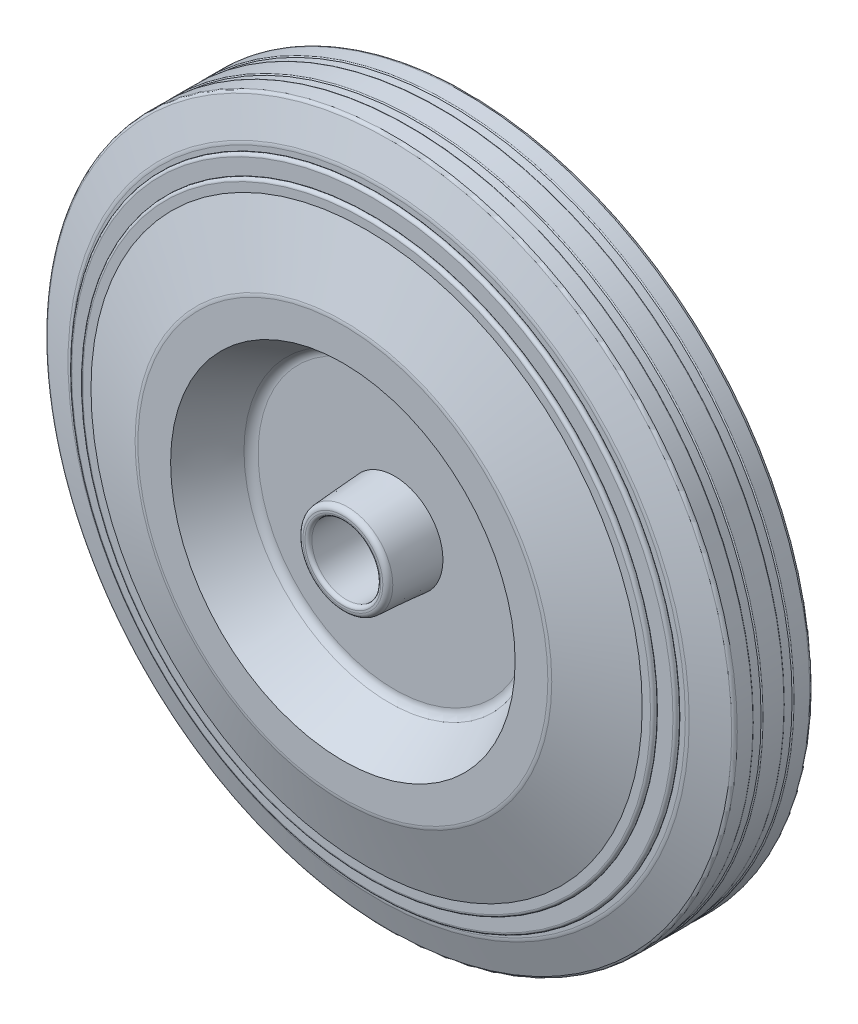
ISO-10303-21;
HEADER;
FILE_DESCRIPTION(('STEP AP214'),'2;1');
FILE_NAME('part.step','',(''),(''),'','','');
FILE_SCHEMA(('AUTOMOTIVE_DESIGN { 1 0 10303 214 1 1 1 1 }'));
ENDSEC;
DATA;
#1=APPLICATION_CONTEXT('core data for automotive mechanical design processes');
#2=APPLICATION_PROTOCOL_DEFINITION('international standard','automotive_design',2000,#1);
#3=PRODUCT_CONTEXT('',#1,'mechanical');
#4=PRODUCT('Part','Part','',(#3));
#5=PRODUCT_RELATED_PRODUCT_CATEGORY('part','',(#4));
#6=PRODUCT_DEFINITION_FORMATION('','',#4);
#7=PRODUCT_DEFINITION_CONTEXT('part definition',#1,'design');
#8=PRODUCT_DEFINITION('design','',#6,#7);
#9=PRODUCT_DEFINITION_SHAPE('','',#8);
#10=(LENGTH_UNIT() NAMED_UNIT(*) SI_UNIT(.MILLI.,.METRE.));
#11=(NAMED_UNIT(*) PLANE_ANGLE_UNIT() SI_UNIT($,.RADIAN.));
#12=(NAMED_UNIT(*) SI_UNIT($,.STERADIAN.) SOLID_ANGLE_UNIT());
#13=UNCERTAINTY_MEASURE_WITH_UNIT(LENGTH_MEASURE(1.E-05),#10,'distance_accuracy_value','');
#14=(GEOMETRIC_REPRESENTATION_CONTEXT(3) GLOBAL_UNCERTAINTY_ASSIGNED_CONTEXT((#13)) GLOBAL_UNIT_ASSIGNED_CONTEXT((#10,
#11,#12)) REPRESENTATION_CONTEXT('',''));
#15=CARTESIAN_POINT('',(0.,0.,0.));
#16=DIRECTION('',(0.,0.,1.));
#17=DIRECTION('',(1.,0.,0.));
#18=AXIS2_PLACEMENT_3D('',#15,#16,#17);
#19=CARTESIAN_POINT('',(0.,0.,-7.80672386710335));
#20=DIRECTION('',(0.,0.,1.));
#21=DIRECTION('',(1.,0.,0.));
#22=AXIS2_PLACEMENT_3D('',#19,#20,#21);
#23=TOROIDAL_SURFACE('',#22,43.6302635970948,0.416666666666667);
#24=CARTESIAN_POINT('',(0.,0.,-8.22339053377002));
#25=DIRECTION('',(0.,0.,1.));
#26=DIRECTION('',(1.,0.,0.));
#27=AXIS2_PLACEMENT_3D('',#24,#25,#26);
#28=CIRCLE('',#27,43.6302635970948);
#29=CARTESIAN_POINT('',(43.6302635970948,0.,-8.22339053377002));
#30=VERTEX_POINT('',#29);
#31=EDGE_CURVE('E91',#30,#30,#28,.T.);
#32=ORIENTED_EDGE('',*,*,#31,.T.);
#33=EDGE_LOOP('',(#32));
#34=FACE_BOUND('',#33,.T.);
#35=CARTESIAN_POINT('',(0.,0.,-7.39005720043668));
#36=DIRECTION('',(0.,0.,1.));
#37=DIRECTION('',(1.,0.,0.));
#38=AXIS2_PLACEMENT_3D('',#35,#36,#37);
#39=CIRCLE('',#38,43.6302635970948);
#40=CARTESIAN_POINT('',(43.6302635970948,0.,-7.39005720043668));
#41=VERTEX_POINT('',#40);
#42=EDGE_CURVE('E243',#41,#41,#39,.T.);
#43=ORIENTED_EDGE('',*,*,#42,.F.);
#44=EDGE_LOOP('',(#43));
#45=FACE_BOUND('',#44,.T.);
#46=ADVANCED_FACE('F43',(#34,#45),#23,.T.);
#47=CARTESIAN_POINT('',(43.6302635970948,0.,-8.22339053377002));
#48=DIRECTION('',(0.,0.,-1.));
#49=DIRECTION('',(-1.,0.,0.));
#50=AXIS2_PLACEMENT_3D('',#47,#48,#49);
#51=PLANE('',#50);
#52=CARTESIAN_POINT('',(0.,0.,-8.22339053377002));
#53=DIRECTION('',(0.,0.,-1.));
#54=DIRECTION('',(-1.,0.,0.));
#55=AXIS2_PLACEMENT_3D('',#52,#53,#54);
#56=CIRCLE('',#55,42.1229587948735);
#57=CARTESIAN_POINT('',(-42.1229587948735,0.,-8.22339053377002));
#58=VERTEX_POINT('',#57);
#59=EDGE_CURVE('E87',#58,#58,#56,.F.);
#60=ORIENTED_EDGE('',*,*,#59,.T.);
#61=EDGE_LOOP('',(#60));
#62=FACE_BOUND('',#61,.T.);
#63=ORIENTED_EDGE('',*,*,#31,.F.);
#64=EDGE_LOOP('',(#63));
#65=FACE_BOUND('',#64,.T.);
#66=ADVANCED_FACE('F252',(#62,#65),#51,.T.);
#67=CARTESIAN_POINT('',(0.,0.,-8.6400572004367));
#68=DIRECTION('',(0.,0.,1.));
#69=DIRECTION('',(1.,0.,0.));
#70=AXIS2_PLACEMENT_3D('',#67,#68,#69);
#71=TOROIDAL_SURFACE('',#70,41.2100878656982,0.416666666666682);
#72=CARTESIAN_POINT('',(0.,0.,-8.67793598831545));
#73=DIRECTION('',(0.,0.,1.));
#74=DIRECTION('',(1.,0.,0.));
#75=AXIS2_PLACEMENT_3D('',#72,#73,#74);
#76=CIRCLE('',#75,41.6250291971413);
#77=CARTESIAN_POINT('',(41.6250291971413,0.,-8.67793598831545));
#78=VERTEX_POINT('',#77);
#79=EDGE_CURVE('E83',#78,#78,#76,.F.);
#80=ORIENTED_EDGE('',*,*,#79,.T.);
#81=EDGE_LOOP('',(#80));
#82=FACE_BOUND('',#81,.T.);
#83=CARTESIAN_POINT('',(0.,0.,-9.05672386710337));
#84=DIRECTION('',(0.,0.,1.));
#85=DIRECTION('',(1.,0.,0.));
#86=AXIS2_PLACEMENT_3D('',#83,#84,#85);
#87=CIRCLE('',#86,41.2100878656982);
#88=CARTESIAN_POINT('',(41.2100878656982,0.,-9.05672386710336));
#89=VERTEX_POINT('',#88);
#90=EDGE_CURVE('E95',#89,#89,#87,.T.);
#91=ORIENTED_EDGE('',*,*,#90,.T.);
#92=EDGE_LOOP('',(#91));
#93=FACE_BOUND('',#92,.T.);
#94=ADVANCED_FACE('F258',(#82,#93),#71,.T.);
#95=CARTESIAN_POINT('',(41.2100878656982,0.,-9.05672386710334));
#96=DIRECTION('',(0.,0.,-1.));
#97=DIRECTION('',(-1.,0.,0.));
#98=AXIS2_PLACEMENT_3D('',#95,#96,#97);
#99=PLANE('',#98);
#100=CARTESIAN_POINT('',(0.,0.,-9.05672386710334));
#101=DIRECTION('',(0.,0.,-1.));
#102=DIRECTION('',(-1.,0.,0.));
#103=AXIS2_PLACEMENT_3D('',#100,#101,#102);
#104=CIRCLE('',#103,40.0836713045406);
#105=CARTESIAN_POINT('',(-40.0836713045406,0.,-9.05672386710334));
#106=VERTEX_POINT('',#105);
#107=EDGE_CURVE('E79',#106,#106,#104,.F.);
#108=ORIENTED_EDGE('',*,*,#107,.T.);
#109=EDGE_LOOP('',(#108));
#110=FACE_BOUND('',#109,.T.);
#111=ORIENTED_EDGE('',*,*,#90,.F.);
#112=EDGE_LOOP('',(#111));
#113=FACE_BOUND('',#112,.T.);
#114=ADVANCED_FACE('F333',(#110,#113),#99,.T.);
#115=CARTESIAN_POINT('',(0.,0.,-9.05672386710332));
#116=DIRECTION('',(0.,0.,1.));
#117=DIRECTION('',(1.,0.,0.));
#118=AXIS2_PLACEMENT_3D('',#115,#116,#117);
#119=CONICAL_SURFACE('',#118,40.,1.23918376891597);
#120=CARTESIAN_POINT('',(0.,0.,-9.08396457930369));
#121=DIRECTION('',(0.,0.,1.));
#122=DIRECTION('',(1.,0.,0.));
#123=AXIS2_PLACEMENT_3D('',#120,#121,#122);
#124=CIRCLE('',#123,39.9208872273121);
#125=CARTESIAN_POINT('',(39.9208872273121,0.,-9.08396457930369));
#126=VERTEX_POINT('',#125);
#127=EDGE_CURVE('E75',#126,#126,#124,.F.);
#128=ORIENTED_EDGE('',*,*,#127,.T.);
#129=EDGE_LOOP('',(#128));
#130=FACE_BOUND('',#129,.T.);
#131=CARTESIAN_POINT('',(0.,0.,-12.418277863399));
#132=DIRECTION('',(0.,0.,1.));
#133=DIRECTION('',(1.,0.,0.));
#134=AXIS2_PLACEMENT_3D('',#131,#132,#133);
#135=CIRCLE('',#134,30.2373383180636);
#136=CARTESIAN_POINT('',(30.2373383180636,0.,-12.418277863399));
#137=VERTEX_POINT('',#136);
#138=EDGE_CURVE('E99',#137,#137,#135,.T.);
#139=ORIENTED_EDGE('',*,*,#138,.T.);
#140=EDGE_LOOP('',(#139));
#141=FACE_BOUND('',#140,.T.);
#142=ADVANCED_FACE('F329',(#130,#141),#119,.T.);
#143=CARTESIAN_POINT('',(0.,0.,-11.));
#144=DIRECTION('',(0.,0.,1.));
#145=DIRECTION('',(1.,0.,0.));
#146=AXIS2_PLACEMENT_3D('',#143,#144,#145);
#147=TOROIDAL_SURFACE('',#146,29.7489860863779,1.49999999999994);
#148=CARTESIAN_POINT('',(0.,0.,-12.5));
#149=DIRECTION('',(0.,0.,1.));
#150=DIRECTION('',(1.,0.,0.));
#151=AXIS2_PLACEMENT_3D('',#148,#149,#150);
#152=CIRCLE('',#151,29.7489860863779);
#153=CARTESIAN_POINT('',(29.7489860863779,0.,-12.5));
#154=VERTEX_POINT('',#153);
#155=EDGE_CURVE('E103',#154,#154,#152,.T.);
#156=ORIENTED_EDGE('',*,*,#155,.T.);
#157=EDGE_LOOP('',(#156));
#158=FACE_BOUND('',#157,.T.);
#159=ORIENTED_EDGE('',*,*,#138,.F.);
#160=EDGE_LOOP('',(#159));
#161=FACE_BOUND('',#160,.T.);
#162=ADVANCED_FACE('F323',(#158,#161),#147,.T.);
#163=CARTESIAN_POINT('',(29.7489860863779,0.,-12.5));
#164=DIRECTION('',(0.,0.,-1.));
#165=DIRECTION('',(-1.,0.,0.));
#166=AXIS2_PLACEMENT_3D('',#163,#164,#165);
#167=PLANE('',#166);
#168=CARTESIAN_POINT('',(0.,0.,-12.5));
#169=DIRECTION('',(0.,0.,-1.));
#170=DIRECTION('',(-1.,0.,0.));
#171=AXIS2_PLACEMENT_3D('',#168,#169,#170);
#172=CIRCLE('',#171,25.2886751345948);
#173=CARTESIAN_POINT('',(-25.2886751345948,0.,-12.5));
#174=VERTEX_POINT('',#173);
#175=EDGE_CURVE('E71',#174,#174,#172,.F.);
#176=ORIENTED_EDGE('',*,*,#175,.T.);
#177=EDGE_LOOP('',(#176));
#178=FACE_BOUND('',#177,.T.);
#179=ORIENTED_EDGE('',*,*,#155,.F.);
#180=EDGE_LOOP('',(#179));
#181=FACE_BOUND('',#180,.T.);
#182=ADVANCED_FACE('F317',(#178,#181),#167,.T.);
#183=CARTESIAN_POINT('',(0.,0.,-12.5));
#184=DIRECTION('',(0.,0.,-1.));
#185=DIRECTION('',(-1.,0.,0.));
#186=AXIS2_PLACEMENT_3D('',#183,#184,#185);
#187=CONICAL_SURFACE('',#186,25.,0.523598775598298);
#188=CARTESIAN_POINT('',(0.,0.,-12.25));
#189=DIRECTION('',(0.,0.,1.));
#190=DIRECTION('',(1.,0.,0.));
#191=AXIS2_PLACEMENT_3D('',#188,#189,#190);
#192=CIRCLE('',#191,24.8556624327026);
#193=CARTESIAN_POINT('',(24.8556624327026,0.,-12.25));
#194=VERTEX_POINT('',#193);
#195=EDGE_CURVE('E67',#194,#194,#192,.F.);
#196=ORIENTED_EDGE('',*,*,#195,.T.);
#197=EDGE_LOOP('',(#196));
#198=FACE_BOUND('',#197,.T.);
#199=CARTESIAN_POINT('',(0.,0.,-5.75000000000001));
#200=DIRECTION('',(0.,0.,1.));
#201=DIRECTION('',(1.,0.,0.));
#202=AXIS2_PLACEMENT_3D('',#199,#200,#201);
#203=CIRCLE('',#202,21.10288568297);
#204=CARTESIAN_POINT('',(21.10288568297,0.,-5.75000000000001));
#205=VERTEX_POINT('',#204);
#206=EDGE_CURVE('E107',#205,#205,#203,.T.);
#207=ORIENTED_EDGE('',*,*,#206,.T.);
#208=EDGE_LOOP('',(#207));
#209=FACE_BOUND('',#208,.T.);
#210=ADVANCED_FACE('F312',(#198,#209),#187,.F.);
#211=CARTESIAN_POINT('',(0.,0.,-6.5));
#212=DIRECTION('',(0.,0.,1.));
#213=DIRECTION('',(1.,0.,0.));
#214=AXIS2_PLACEMENT_3D('',#211,#212,#213);
#215=TOROIDAL_SURFACE('',#214,19.8038475772934,1.50000000000001);
#216=CARTESIAN_POINT('',(0.,0.,-4.99999999999999));
#217=DIRECTION('',(0.,0.,1.));
#218=DIRECTION('',(1.,0.,0.));
#219=AXIS2_PLACEMENT_3D('',#216,#217,#218);
#220=CIRCLE('',#219,19.8038475772934);
#221=CARTESIAN_POINT('',(19.8038475772934,0.,-4.99999999999999));
#222=VERTEX_POINT('',#221);
#223=EDGE_CURVE('E111',#222,#222,#220,.T.);
#224=ORIENTED_EDGE('',*,*,#223,.T.);
#225=EDGE_LOOP('',(#224));
#226=FACE_BOUND('',#225,.T.);
#227=ORIENTED_EDGE('',*,*,#206,.F.);
#228=EDGE_LOOP('',(#227));
#229=FACE_BOUND('',#228,.T.);
#230=ADVANCED_FACE('F306',(#226,#229),#215,.F.);
#231=CARTESIAN_POINT('',(19.8038475772934,0.,-5.));
#232=DIRECTION('',(0.,0.,-1.));
#233=DIRECTION('',(-1.,0.,0.));
#234=AXIS2_PLACEMENT_3D('',#231,#232,#233);
#235=PLANE('',#234);
#236=CARTESIAN_POINT('',(0.,0.,-5.));
#237=DIRECTION('',(0.,0.,1.));
#238=DIRECTION('',(1.,0.,0.));
#239=AXIS2_PLACEMENT_3D('',#236,#237,#238);
#240=CIRCLE('',#239,7.02445108957632);
#241=CARTESIAN_POINT('',(7.02445108957632,0.,-5.));
#242=VERTEX_POINT('',#241);
#243=EDGE_CURVE('E115',#242,#242,#240,.T.);
#244=ORIENTED_EDGE('',*,*,#243,.T.);
#245=EDGE_LOOP('',(#244));
#246=FACE_BOUND('',#245,.T.);
#247=ORIENTED_EDGE('',*,*,#223,.F.);
#248=EDGE_LOOP('',(#247));
#249=FACE_BOUND('',#248,.T.);
#250=ADVANCED_FACE('F300',(#246,#249),#235,.T.);
#251=CARTESIAN_POINT('',(0.,0.,-5.));
#252=DIRECTION('',(0.,0.,1.));
#253=DIRECTION('',(1.,0.,0.));
#254=AXIS2_PLACEMENT_3D('',#251,#252,#253);
#255=CONICAL_SURFACE('',#254,7.02445108957632,0.0698131700797729);
#256=CARTESIAN_POINT('',(0.,0.,-11.8023173553081));
#257=DIRECTION('',(0.,0.,1.));
#258=DIRECTION('',(1.,0.,0.));
#259=AXIS2_PLACEMENT_3D('',#256,#257,#258);
#260=CIRCLE('',#259,6.54878672309162);
#261=CARTESIAN_POINT('',(6.54878672309162,0.,-11.8023173553081));
#262=VERTEX_POINT('',#261);
#263=EDGE_CURVE('E119',#262,#262,#260,.T.);
#264=ORIENTED_EDGE('',*,*,#263,.T.);
#265=EDGE_LOOP('',(#264));
#266=FACE_BOUND('',#265,.T.);
#267=ORIENTED_EDGE('',*,*,#243,.F.);
#268=EDGE_LOOP('',(#267));
#269=FACE_BOUND('',#268,.T.);
#270=ADVANCED_FACE('F294',(#266,#269),#255,.T.);
#271=CARTESIAN_POINT('',(0.,0.,-11.75));
#272=DIRECTION('',(0.,0.,1.));
#273=DIRECTION('',(1.,0.,0.));
#274=AXIS2_PLACEMENT_3D('',#271,#272,#273);
#275=TOROIDAL_SURFACE('',#274,5.80061368539675,0.750000000000004);
#276=CARTESIAN_POINT('',(0.,0.,-12.5));
#277=DIRECTION('',(0.,0.,1.));
#278=DIRECTION('',(1.,0.,0.));
#279=AXIS2_PLACEMENT_3D('',#276,#277,#278);
#280=CIRCLE('',#279,5.80061368539674);
#281=CARTESIAN_POINT('',(5.80061368539674,0.,-12.5));
#282=VERTEX_POINT('',#281);
#283=EDGE_CURVE('E123',#282,#282,#280,.T.);
#284=ORIENTED_EDGE('',*,*,#283,.T.);
#285=EDGE_LOOP('',(#284));
#286=FACE_BOUND('',#285,.T.);
#287=ORIENTED_EDGE('',*,*,#263,.F.);
#288=EDGE_LOOP('',(#287));
#289=FACE_BOUND('',#288,.T.);
#290=ADVANCED_FACE('F288',(#286,#289),#275,.T.);
#291=CARTESIAN_POINT('',(5.80061368539674,0.,-12.5));
#292=DIRECTION('',(0.,0.,-1.));
#293=DIRECTION('',(-1.,0.,0.));
#294=AXIS2_PLACEMENT_3D('',#291,#292,#293);
#295=PLANE('',#294);
#296=CARTESIAN_POINT('',(0.,0.,-12.5));
#297=DIRECTION('',(0.,0.,-1.));
#298=DIRECTION('',(-1.,0.,0.));
#299=AXIS2_PLACEMENT_3D('',#296,#297,#298);
#300=CIRCLE('',#299,5.5);
#301=CARTESIAN_POINT('',(-5.5,0.,-12.5));
#302=VERTEX_POINT('',#301);
#303=EDGE_CURVE('E61',#302,#302,#300,.F.);
#304=ORIENTED_EDGE('',*,*,#303,.T.);
#305=EDGE_LOOP('',(#304));
#306=FACE_BOUND('',#305,.T.);
#307=ORIENTED_EDGE('',*,*,#283,.F.);
#308=EDGE_LOOP('',(#307));
#309=FACE_BOUND('',#308,.T.);
#310=ADVANCED_FACE('F284',(#306,#309),#295,.T.);
#311=CARTESIAN_POINT('',(0.,0.,-12.5019359230369));
#312=DIRECTION('',(0.,0.,1.));
#313=DIRECTION('',(1.,0.,0.));
#314=AXIS2_PLACEMENT_3D('',#311,#312,#313);
#315=CYLINDRICAL_SURFACE('',#314,5.);
#316=CARTESIAN_POINT('',(0.,0.,-12.));
#317=DIRECTION('',(0.,0.,-1.));
#318=DIRECTION('',(-1.,0.,0.));
#319=AXIS2_PLACEMENT_3D('',#316,#317,#318);
#320=CIRCLE('',#319,5.);
#321=CARTESIAN_POINT('',(-5.,0.,-12.));
#322=VERTEX_POINT('',#321);
#323=EDGE_CURVE('E51',#322,#322,#320,.T.);
#324=ORIENTED_EDGE('',*,*,#323,.T.);
#325=EDGE_LOOP('',(#324));
#326=FACE_BOUND('',#325,.T.);
#327=CARTESIAN_POINT('',(0.,0.,12.));
#328=DIRECTION('',(0.,0.,1.));
#329=DIRECTION('',(1.,0.,0.));
#330=AXIS2_PLACEMENT_3D('',#327,#328,#329);
#331=CIRCLE('',#330,5.);
#332=CARTESIAN_POINT('',(5.,0.,12.));
#333=VERTEX_POINT('',#332);
#334=EDGE_CURVE('E56',#333,#333,#331,.T.);
#335=ORIENTED_EDGE('',*,*,#334,.T.);
#336=EDGE_LOOP('',(#335));
#337=FACE_BOUND('',#336,.T.);
#338=ADVANCED_FACE('F287',(#326,#337),#315,.F.);
#339=CARTESIAN_POINT('',(5.,0.,12.5));
#340=DIRECTION('',(0.,0.,1.));
#341=DIRECTION('',(1.,0.,0.));
#342=AXIS2_PLACEMENT_3D('',#339,#340,#341);
#343=PLANE('',#342);
#344=CARTESIAN_POINT('',(0.,0.,12.5));
#345=DIRECTION('',(0.,0.,1.));
#346=DIRECTION('',(1.,0.,0.));
#347=AXIS2_PLACEMENT_3D('',#344,#345,#346);
#348=CIRCLE('',#347,5.5);
#349=CARTESIAN_POINT('',(5.5,0.,12.5));
#350=VERTEX_POINT('',#349);
#351=EDGE_CURVE('E10',#350,#350,#348,.F.);
#352=ORIENTED_EDGE('',*,*,#351,.T.);
#353=EDGE_LOOP('',(#352));
#354=FACE_BOUND('',#353,.T.);
#355=CARTESIAN_POINT('',(0.,0.,12.5));
#356=DIRECTION('',(0.,0.,1.));
#357=DIRECTION('',(1.,0.,0.));
#358=AXIS2_PLACEMENT_3D('',#355,#356,#357);
#359=CIRCLE('',#358,5.80061368539675);
#360=CARTESIAN_POINT('',(5.80061368539674,0.,12.5));
#361=VERTEX_POINT('',#360);
#362=EDGE_CURVE('E127',#361,#361,#359,.T.);
#363=ORIENTED_EDGE('',*,*,#362,.T.);
#364=EDGE_LOOP('',(#363));
#365=FACE_BOUND('',#364,.T.);
#366=ADVANCED_FACE('F410',(#354,#365),#343,.T.);
#367=CARTESIAN_POINT('',(0.,0.,11.75));
#368=DIRECTION('',(0.,0.,1.));
#369=DIRECTION('',(1.,0.,0.));
#370=AXIS2_PLACEMENT_3D('',#367,#368,#369);
#371=TOROIDAL_SURFACE('',#370,5.80061368539675,0.750000000000002);
#372=CARTESIAN_POINT('',(0.,0.,11.8023173553081));
#373=DIRECTION('',(0.,0.,1.));
#374=DIRECTION('',(1.,0.,0.));
#375=AXIS2_PLACEMENT_3D('',#372,#373,#374);
#376=CIRCLE('',#375,6.54878672309162);
#377=CARTESIAN_POINT('',(6.54878672309162,0.,11.8023173553081));
#378=VERTEX_POINT('',#377);
#379=EDGE_CURVE('E131',#378,#378,#376,.T.);
#380=ORIENTED_EDGE('',*,*,#379,.T.);
#381=EDGE_LOOP('',(#380));
#382=FACE_BOUND('',#381,.T.);
#383=ORIENTED_EDGE('',*,*,#362,.F.);
#384=EDGE_LOOP('',(#383));
#385=FACE_BOUND('',#384,.T.);
#386=ADVANCED_FACE('F419',(#382,#385),#371,.T.);
#387=CARTESIAN_POINT('',(0.,0.,11.8023173553081));
#388=DIRECTION('',(0.,0.,-1.));
#389=DIRECTION('',(-1.,0.,0.));
#390=AXIS2_PLACEMENT_3D('',#387,#388,#389);
#391=CONICAL_SURFACE('',#390,6.54878672309162,0.0698131700797733);
#392=CARTESIAN_POINT('',(0.,0.,5.));
#393=DIRECTION('',(0.,0.,1.));
#394=DIRECTION('',(1.,0.,0.));
#395=AXIS2_PLACEMENT_3D('',#392,#393,#394);
#396=CIRCLE('',#395,7.02445108957632);
#397=CARTESIAN_POINT('',(7.02445108957632,0.,5.));
#398=VERTEX_POINT('',#397);
#399=EDGE_CURVE('E135',#398,#398,#396,.T.);
#400=ORIENTED_EDGE('',*,*,#399,.T.);
#401=EDGE_LOOP('',(#400));
#402=FACE_BOUND('',#401,.T.);
#403=ORIENTED_EDGE('',*,*,#379,.F.);
#404=EDGE_LOOP('',(#403));
#405=FACE_BOUND('',#404,.T.);
#406=ADVANCED_FACE('F428',(#402,#405),#391,.T.);
#407=CARTESIAN_POINT('',(7.02445108957632,0.,5.));
#408=DIRECTION('',(0.,0.,1.));
#409=DIRECTION('',(1.,0.,0.));
#410=AXIS2_PLACEMENT_3D('',#407,#408,#409);
#411=PLANE('',#410);
#412=CARTESIAN_POINT('',(0.,0.,5.));
#413=DIRECTION('',(0.,0.,1.));
#414=DIRECTION('',(1.,0.,0.));
#415=AXIS2_PLACEMENT_3D('',#412,#413,#414);
#416=CIRCLE('',#415,19.8038475772934);
#417=CARTESIAN_POINT('',(19.8038475772934,0.,5.00000000000001));
#418=VERTEX_POINT('',#417);
#419=EDGE_CURVE('E139',#418,#418,#416,.T.);
#420=ORIENTED_EDGE('',*,*,#419,.T.);
#421=EDGE_LOOP('',(#420));
#422=FACE_BOUND('',#421,.T.);
#423=ORIENTED_EDGE('',*,*,#399,.F.);
#424=EDGE_LOOP('',(#423));
#425=FACE_BOUND('',#424,.T.);
#426=ADVANCED_FACE('F438',(#422,#425),#411,.T.);
#427=CARTESIAN_POINT('',(0.,0.,6.49999999999995));
#428=DIRECTION('',(0.,0.,1.));
#429=DIRECTION('',(1.,0.,0.));
#430=AXIS2_PLACEMENT_3D('',#427,#428,#429);
#431=TOROIDAL_SURFACE('',#430,19.8038475772934,1.49999999999995);
#432=CARTESIAN_POINT('',(0.,0.,5.75));
#433=DIRECTION('',(0.,0.,1.));
#434=DIRECTION('',(1.,0.,0.));
#435=AXIS2_PLACEMENT_3D('',#432,#433,#434);
#436=CIRCLE('',#435,21.10288568297);
#437=CARTESIAN_POINT('',(21.10288568297,0.,5.75));
#438=VERTEX_POINT('',#437);
#439=EDGE_CURVE('E143',#438,#438,#436,.T.);
#440=ORIENTED_EDGE('',*,*,#439,.T.);
#441=EDGE_LOOP('',(#440));
#442=FACE_BOUND('',#441,.T.);
#443=ORIENTED_EDGE('',*,*,#419,.F.);
#444=EDGE_LOOP('',(#443));
#445=FACE_BOUND('',#444,.T.);
#446=ADVANCED_FACE('F448',(#442,#445),#431,.F.);
#447=CARTESIAN_POINT('',(0.,0.,5.75));
#448=DIRECTION('',(0.,0.,1.));
#449=DIRECTION('',(1.,0.,0.));
#450=AXIS2_PLACEMENT_3D('',#447,#448,#449);
#451=CONICAL_SURFACE('',#450,21.10288568297,0.523598775598298);
#452=CARTESIAN_POINT('',(0.,0.,12.5));
#453=DIRECTION('',(0.,0.,1.));
#454=DIRECTION('',(1.,0.,0.));
#455=AXIS2_PLACEMENT_3D('',#452,#453,#454);
#456=CIRCLE('',#455,25.);
#457=CARTESIAN_POINT('',(25.,0.,12.5));
#458=VERTEX_POINT('',#457);
#459=EDGE_CURVE('E147',#458,#458,#456,.T.);
#460=ORIENTED_EDGE('',*,*,#459,.T.);
#461=EDGE_LOOP('',(#460));
#462=FACE_BOUND('',#461,.T.);
#463=ORIENTED_EDGE('',*,*,#439,.F.);
#464=EDGE_LOOP('',(#463));
#465=FACE_BOUND('',#464,.T.);
#466=ADVANCED_FACE('F458',(#462,#465),#451,.F.);
#467=CARTESIAN_POINT('',(25.,0.,12.5));
#468=DIRECTION('',(0.,0.,1.));
#469=DIRECTION('',(1.,0.,0.));
#470=AXIS2_PLACEMENT_3D('',#467,#468,#469);
#471=PLANE('',#470);
#472=CARTESIAN_POINT('',(0.,0.,12.5));
#473=DIRECTION('',(0.,0.,1.));
#474=DIRECTION('',(1.,0.,0.));
#475=AXIS2_PLACEMENT_3D('',#472,#473,#474);
#476=CIRCLE('',#475,29.7489860863779);
#477=CARTESIAN_POINT('',(29.7489860863779,0.,12.5));
#478=VERTEX_POINT('',#477);
#479=EDGE_CURVE('E151',#478,#478,#476,.T.);
#480=ORIENTED_EDGE('',*,*,#479,.T.);
#481=EDGE_LOOP('',(#480));
#482=FACE_BOUND('',#481,.T.);
#483=ORIENTED_EDGE('',*,*,#459,.F.);
#484=EDGE_LOOP('',(#483));
#485=FACE_BOUND('',#484,.T.);
#486=ADVANCED_FACE('F468',(#482,#485),#471,.T.);
#487=CARTESIAN_POINT('',(0.,0.,11.));
#488=DIRECTION('',(0.,0.,1.));
#489=DIRECTION('',(1.,0.,0.));
#490=AXIS2_PLACEMENT_3D('',#487,#488,#489);
#491=TOROIDAL_SURFACE('',#490,29.7489860863779,1.49999999999995);
#492=CARTESIAN_POINT('',(0.,0.,12.418277863399));
#493=DIRECTION('',(0.,0.,1.));
#494=DIRECTION('',(1.,0.,0.));
#495=AXIS2_PLACEMENT_3D('',#492,#493,#494);
#496=CIRCLE('',#495,30.2373383180636);
#497=CARTESIAN_POINT('',(30.2373383180636,0.,12.418277863399));
#498=VERTEX_POINT('',#497);
#499=EDGE_CURVE('E155',#498,#498,#496,.T.);
#500=ORIENTED_EDGE('',*,*,#499,.T.);
#501=EDGE_LOOP('',(#500));
#502=FACE_BOUND('',#501,.T.);
#503=ORIENTED_EDGE('',*,*,#479,.F.);
#504=EDGE_LOOP('',(#503));
#505=FACE_BOUND('',#504,.T.);
#506=ADVANCED_FACE('F478',(#502,#505),#491,.T.);
#507=CARTESIAN_POINT('',(0.,0.,12.418277863399));
#508=DIRECTION('',(0.,0.,-1.));
#509=DIRECTION('',(-1.,0.,0.));
#510=AXIS2_PLACEMENT_3D('',#507,#508,#509);
#511=CONICAL_SURFACE('',#510,30.2373383180636,1.23918376891597);
#512=CARTESIAN_POINT('',(0.,0.,9.05672386710331));
#513=DIRECTION('',(0.,0.,1.));
#514=DIRECTION('',(1.,0.,0.));
#515=AXIS2_PLACEMENT_3D('',#512,#513,#514);
#516=CIRCLE('',#515,40.);
#517=CARTESIAN_POINT('',(40.,0.,9.05672386710331));
#518=VERTEX_POINT('',#517);
#519=EDGE_CURVE('E159',#518,#518,#516,.T.);
#520=ORIENTED_EDGE('',*,*,#519,.T.);
#521=EDGE_LOOP('',(#520));
#522=FACE_BOUND('',#521,.T.);
#523=ORIENTED_EDGE('',*,*,#499,.F.);
#524=EDGE_LOOP('',(#523));
#525=FACE_BOUND('',#524,.T.);
#526=ADVANCED_FACE('F488',(#522,#525),#511,.T.);
#527=CARTESIAN_POINT('',(40.,0.,9.05672386710334));
#528=DIRECTION('',(0.,0.,1.));
#529=DIRECTION('',(1.,0.,0.));
#530=AXIS2_PLACEMENT_3D('',#527,#528,#529);
#531=PLANE('',#530);
#532=CARTESIAN_POINT('',(0.,0.,9.05672386710336));
#533=DIRECTION('',(0.,0.,1.));
#534=DIRECTION('',(1.,0.,0.));
#535=AXIS2_PLACEMENT_3D('',#532,#533,#534);
#536=CIRCLE('',#535,41.2100878656983);
#537=CARTESIAN_POINT('',(41.2100878656983,0.,9.05672386710336));
#538=VERTEX_POINT('',#537);
#539=EDGE_CURVE('E163',#538,#538,#536,.T.);
#540=ORIENTED_EDGE('',*,*,#539,.T.);
#541=EDGE_LOOP('',(#540));
#542=FACE_BOUND('',#541,.T.);
#543=ORIENTED_EDGE('',*,*,#519,.F.);
#544=EDGE_LOOP('',(#543));
#545=FACE_BOUND('',#544,.T.);
#546=ADVANCED_FACE('F498',(#542,#545),#531,.T.);
#547=CARTESIAN_POINT('',(0.,0.,8.6400572004367));
#548=DIRECTION('',(0.,0.,1.));
#549=DIRECTION('',(1.,0.,0.));
#550=AXIS2_PLACEMENT_3D('',#547,#548,#549);
#551=TOROIDAL_SURFACE('',#550,41.2100878656982,0.416666666666657);
#552=CARTESIAN_POINT('',(0.,0.,8.22339053377003));
#553=DIRECTION('',(0.,0.,1.));
#554=DIRECTION('',(1.,0.,0.));
#555=AXIS2_PLACEMENT_3D('',#552,#553,#554);
#556=CIRCLE('',#555,41.2100878656982);
#557=CARTESIAN_POINT('',(41.2100878656982,0.,8.22339053377003));
#558=VERTEX_POINT('',#557);
#559=EDGE_CURVE('E167',#558,#558,#556,.T.);
#560=ORIENTED_EDGE('',*,*,#559,.T.);
#561=EDGE_LOOP('',(#560));
#562=FACE_BOUND('',#561,.T.);
#563=ORIENTED_EDGE('',*,*,#539,.F.);
#564=EDGE_LOOP('',(#563));
#565=FACE_BOUND('',#564,.T.);
#566=ADVANCED_FACE('F508',(#562,#565),#551,.T.);
#567=CARTESIAN_POINT('',(41.2100878656982,0.,8.22339053377002));
#568=DIRECTION('',(0.,0.,1.));
#569=DIRECTION('',(1.,0.,0.));
#570=AXIS2_PLACEMENT_3D('',#567,#568,#569);
#571=PLANE('',#570);
#572=CARTESIAN_POINT('',(0.,0.,8.22339053377001));
#573=DIRECTION('',(0.,0.,1.));
#574=DIRECTION('',(1.,0.,0.));
#575=AXIS2_PLACEMENT_3D('',#572,#573,#574);
#576=CIRCLE('',#575,43.6302635970948);
#577=CARTESIAN_POINT('',(43.6302635970948,0.,8.22339053377001));
#578=VERTEX_POINT('',#577);
#579=EDGE_CURVE('E171',#578,#578,#576,.T.);
#580=ORIENTED_EDGE('',*,*,#579,.T.);
#581=EDGE_LOOP('',(#580));
#582=FACE_BOUND('',#581,.T.);
#583=ORIENTED_EDGE('',*,*,#559,.F.);
#584=EDGE_LOOP('',(#583));
#585=FACE_BOUND('',#584,.T.);
#586=ADVANCED_FACE('F518',(#582,#585),#571,.T.);
#587=CARTESIAN_POINT('',(0.,0.,7.80672386710335));
#588=DIRECTION('',(0.,0.,1.));
#589=DIRECTION('',(1.,0.,0.));
#590=AXIS2_PLACEMENT_3D('',#587,#588,#589);
#591=TOROIDAL_SURFACE('',#590,43.6302635970948,0.416666666666657);
#592=CARTESIAN_POINT('',(0.,0.,7.39005720043668));
#593=DIRECTION('',(0.,0.,1.));
#594=DIRECTION('',(1.,0.,0.));
#595=AXIS2_PLACEMENT_3D('',#592,#593,#594);
#596=CIRCLE('',#595,43.6302635970948);
#597=CARTESIAN_POINT('',(43.6302635970948,0.,7.39005720043669));
#598=VERTEX_POINT('',#597);
#599=EDGE_CURVE('E175',#598,#598,#596,.T.);
#600=ORIENTED_EDGE('',*,*,#599,.T.);
#601=EDGE_LOOP('',(#600));
#602=FACE_BOUND('',#601,.T.);
#603=ORIENTED_EDGE('',*,*,#579,.F.);
#604=EDGE_LOOP('',(#603));
#605=FACE_BOUND('',#604,.T.);
#606=ADVANCED_FACE('F528',(#602,#605),#591,.T.);
#607=CARTESIAN_POINT('',(43.6302635970948,0.,7.39005720043669));
#608=DIRECTION('',(0.,0.,1.));
#609=DIRECTION('',(1.,0.,0.));
#610=AXIS2_PLACEMENT_3D('',#607,#608,#609);
#611=PLANE('',#610);
#612=CARTESIAN_POINT('',(0.,0.,7.3900572004367));
#613=DIRECTION('',(0.,0.,1.));
#614=DIRECTION('',(1.,0.,0.));
#615=AXIS2_PLACEMENT_3D('',#612,#613,#614);
#616=CIRCLE('',#615,44.5893375491709);
#617=CARTESIAN_POINT('',(44.5893375491709,0.,7.3900572004367));
#618=VERTEX_POINT('',#617);
#619=EDGE_CURVE('E179',#618,#618,#616,.T.);
#620=ORIENTED_EDGE('',*,*,#619,.T.);
#621=EDGE_LOOP('',(#620));
#622=FACE_BOUND('',#621,.T.);
#623=ORIENTED_EDGE('',*,*,#599,.F.);
#624=EDGE_LOOP('',(#623));
#625=FACE_BOUND('',#624,.T.);
#626=ADVANCED_FACE('F538',(#622,#625),#611,.T.);
#627=CARTESIAN_POINT('',(0.,0.,5.8900572004366));
#628=DIRECTION('',(0.,0.,1.));
#629=DIRECTION('',(1.,0.,0.));
#630=AXIS2_PLACEMENT_3D('',#627,#628,#629);
#631=TOROIDAL_SURFACE('',#630,44.5893375491709,1.5000000000001);
#632=CARTESIAN_POINT('',(0.,0.,7.30833506383568));
#633=DIRECTION('',(0.,0.,1.));
#634=DIRECTION('',(1.,0.,0.));
#635=AXIS2_PLACEMENT_3D('',#632,#633,#634);
#636=CIRCLE('',#635,45.0776897808567);
#637=CARTESIAN_POINT('',(45.0776897808567,0.,7.30833506383568));
#638=VERTEX_POINT('',#637);
#639=EDGE_CURVE('E183',#638,#638,#636,.T.);
#640=ORIENTED_EDGE('',*,*,#639,.T.);
#641=EDGE_LOOP('',(#640));
#642=FACE_BOUND('',#641,.T.);
#643=ORIENTED_EDGE('',*,*,#619,.F.);
#644=EDGE_LOOP('',(#643));
#645=FACE_BOUND('',#644,.T.);
#646=ADVANCED_FACE('F548',(#642,#645),#631,.T.);
#647=CARTESIAN_POINT('',(0.,0.,7.30833506383568));
#648=DIRECTION('',(0.,0.,-1.));
#649=DIRECTION('',(-1.,0.,0.));
#650=AXIS2_PLACEMENT_3D('',#647,#648,#649);
#651=CONICAL_SURFACE('',#650,45.0776897808567,1.23918376891597);
#652=CARTESIAN_POINT('',(0.,0.,5.72956048805784));
#653=DIRECTION('',(0.,0.,1.));
#654=DIRECTION('',(1.,0.,0.));
#655=AXIS2_PLACEMENT_3D('',#652,#653,#654);
#656=CIRCLE('',#655,49.6627840772286);
#657=CARTESIAN_POINT('',(49.6627840772286,0.,5.72956048805785));
#658=VERTEX_POINT('',#657);
#659=EDGE_CURVE('E187',#658,#658,#656,.T.);
#660=ORIENTED_EDGE('',*,*,#659,.T.);
#661=EDGE_LOOP('',(#660));
#662=FACE_BOUND('',#661,.T.);
#663=ORIENTED_EDGE('',*,*,#639,.F.);
#664=EDGE_LOOP('',(#663));
#665=FACE_BOUND('',#664,.T.);
#666=ADVANCED_FACE('F558',(#662,#665),#651,.T.);
#667=CARTESIAN_POINT('',(0.,0.,5.2568012002582));
#668=DIRECTION('',(0.,0.,1.));
#669=DIRECTION('',(1.,0.,0.));
#670=AXIS2_PLACEMENT_3D('',#667,#668,#669);
#671=TOROIDAL_SURFACE('',#670,49.5,0.49999999999999);
#672=CARTESIAN_POINT('',(0.,0.,5.2568012002582));
#673=DIRECTION('',(0.,0.,1.));
#674=DIRECTION('',(1.,0.,0.));
#675=AXIS2_PLACEMENT_3D('',#672,#673,#674);
#676=CIRCLE('',#675,50.);
#677=CARTESIAN_POINT('',(50.,0.,5.2568012002582));
#678=VERTEX_POINT('',#677);
#679=EDGE_CURVE('E191',#678,#678,#676,.T.);
#680=ORIENTED_EDGE('',*,*,#679,.T.);
#681=EDGE_LOOP('',(#680));
#682=FACE_BOUND('',#681,.T.);
#683=ORIENTED_EDGE('',*,*,#659,.F.);
#684=EDGE_LOOP('',(#683));
#685=FACE_BOUND('',#684,.T.);
#686=ADVANCED_FACE('F568',(#682,#685),#671,.T.);
#687=CARTESIAN_POINT('',(0.,0.,-12.5019359230369));
#688=DIRECTION('',(0.,0.,1.));
#689=DIRECTION('',(1.,0.,0.));
#690=AXIS2_PLACEMENT_3D('',#687,#688,#689);
#691=CYLINDRICAL_SURFACE('',#690,50.);
#692=CARTESIAN_POINT('',(0.,0.,3.));
#693=DIRECTION('',(0.,0.,1.));
#694=DIRECTION('',(1.,0.,0.));
#695=AXIS2_PLACEMENT_3D('',#692,#693,#694);
#696=CIRCLE('',#695,50.);
#697=CARTESIAN_POINT('',(50.,0.,3.));
#698=VERTEX_POINT('',#697);
#699=EDGE_CURVE('E195',#698,#698,#696,.T.);
#700=ORIENTED_EDGE('',*,*,#699,.T.);
#701=EDGE_LOOP('',(#700));
#702=FACE_BOUND('',#701,.T.);
#703=ORIENTED_EDGE('',*,*,#679,.F.);
#704=EDGE_LOOP('',(#703));
#705=FACE_BOUND('',#704,.T.);
#706=ADVANCED_FACE('F578',(#702,#705),#691,.T.);
#707=CARTESIAN_POINT('',(0.,0.,3.));
#708=DIRECTION('',(0.,0.,1.));
#709=DIRECTION('',(1.,0.,0.));
#710=AXIS2_PLACEMENT_3D('',#707,#708,#709);
#711=TOROIDAL_SURFACE('',#710,49.85,0.149999999999999);
#712=CARTESIAN_POINT('',(0.,0.,2.85));
#713=DIRECTION('',(0.,0.,1.));
#714=DIRECTION('',(1.,0.,0.));
#715=AXIS2_PLACEMENT_3D('',#712,#713,#714);
#716=CIRCLE('',#715,49.85);
#717=CARTESIAN_POINT('',(49.85,0.,2.85));
#718=VERTEX_POINT('',#717);
#719=EDGE_CURVE('E199',#718,#718,#716,.T.);
#720=ORIENTED_EDGE('',*,*,#719,.T.);
#721=EDGE_LOOP('',(#720));
#722=FACE_BOUND('',#721,.T.);
#723=ORIENTED_EDGE('',*,*,#699,.F.);
#724=EDGE_LOOP('',(#723));
#725=FACE_BOUND('',#724,.T.);
#726=ADVANCED_FACE('F588',(#722,#725),#711,.T.);
#727=CARTESIAN_POINT('',(0.,0.,-12.5019359230369));
#728=DIRECTION('',(0.,0.,1.));
#729=DIRECTION('',(1.,0.,0.));
#730=AXIS2_PLACEMENT_3D('',#727,#728,#729);
#731=CYLINDRICAL_SURFACE('',#730,49.85);
#732=CARTESIAN_POINT('',(0.,0.,1.65));
#733=DIRECTION('',(0.,0.,1.));
#734=DIRECTION('',(1.,0.,0.));
#735=AXIS2_PLACEMENT_3D('',#732,#733,#734);
#736=CIRCLE('',#735,49.85);
#737=CARTESIAN_POINT('',(49.85,0.,1.65));
#738=VERTEX_POINT('',#737);
#739=EDGE_CURVE('E203',#738,#738,#736,.T.);
#740=ORIENTED_EDGE('',*,*,#739,.T.);
#741=EDGE_LOOP('',(#740));
#742=FACE_BOUND('',#741,.T.);
#743=ORIENTED_EDGE('',*,*,#719,.F.);
#744=EDGE_LOOP('',(#743));
#745=FACE_BOUND('',#744,.T.);
#746=ADVANCED_FACE('F598',(#742,#745),#731,.T.);
#747=CARTESIAN_POINT('',(0.,0.,1.5));
#748=DIRECTION('',(0.,0.,1.));
#749=DIRECTION('',(1.,0.,0.));
#750=AXIS2_PLACEMENT_3D('',#747,#748,#749);
#751=TOROIDAL_SURFACE('',#750,49.85,0.149999999999997);
#752=CARTESIAN_POINT('',(0.,0.,1.5));
#753=DIRECTION('',(0.,0.,1.));
#754=DIRECTION('',(1.,0.,0.));
#755=AXIS2_PLACEMENT_3D('',#752,#753,#754);
#756=CIRCLE('',#755,50.);
#757=CARTESIAN_POINT('',(50.,0.,1.5));
#758=VERTEX_POINT('',#757);
#759=EDGE_CURVE('E207',#758,#758,#756,.T.);
#760=ORIENTED_EDGE('',*,*,#759,.T.);
#761=EDGE_LOOP('',(#760));
#762=FACE_BOUND('',#761,.T.);
#763=ORIENTED_EDGE('',*,*,#739,.F.);
#764=EDGE_LOOP('',(#763));
#765=FACE_BOUND('',#764,.T.);
#766=ADVANCED_FACE('F608',(#762,#765),#751,.T.);
#767=CARTESIAN_POINT('',(0.,0.,-12.5019359230369));
#768=DIRECTION('',(0.,0.,1.));
#769=DIRECTION('',(1.,0.,0.));
#770=AXIS2_PLACEMENT_3D('',#767,#768,#769);
#771=CYLINDRICAL_SURFACE('',#770,50.);
#772=CARTESIAN_POINT('',(0.,0.,-1.5));
#773=DIRECTION('',(0.,0.,1.));
#774=DIRECTION('',(1.,0.,0.));
#775=AXIS2_PLACEMENT_3D('',#772,#773,#774);
#776=CIRCLE('',#775,50.);
#777=CARTESIAN_POINT('',(50.,0.,-1.5));
#778=VERTEX_POINT('',#777);
#779=EDGE_CURVE('E211',#778,#778,#776,.T.);
#780=ORIENTED_EDGE('',*,*,#779,.T.);
#781=EDGE_LOOP('',(#780));
#782=FACE_BOUND('',#781,.T.);
#783=ORIENTED_EDGE('',*,*,#759,.F.);
#784=EDGE_LOOP('',(#783));
#785=FACE_BOUND('',#784,.T.);
#786=ADVANCED_FACE('F618',(#782,#785),#771,.T.);
#787=CARTESIAN_POINT('',(0.,0.,-1.5));
#788=DIRECTION('',(0.,0.,1.));
#789=DIRECTION('',(1.,0.,0.));
#790=AXIS2_PLACEMENT_3D('',#787,#788,#789);
#791=TOROIDAL_SURFACE('',#790,49.85,0.149999999999999);
#792=CARTESIAN_POINT('',(0.,0.,-1.65));
#793=DIRECTION('',(0.,0.,1.));
#794=DIRECTION('',(1.,0.,0.));
#795=AXIS2_PLACEMENT_3D('',#792,#793,#794);
#796=CIRCLE('',#795,49.85);
#797=CARTESIAN_POINT('',(49.85,0.,-1.65));
#798=VERTEX_POINT('',#797);
#799=EDGE_CURVE('E215',#798,#798,#796,.T.);
#800=ORIENTED_EDGE('',*,*,#799,.T.);
#801=EDGE_LOOP('',(#800));
#802=FACE_BOUND('',#801,.T.);
#803=ORIENTED_EDGE('',*,*,#779,.F.);
#804=EDGE_LOOP('',(#803));
#805=FACE_BOUND('',#804,.T.);
#806=ADVANCED_FACE('F628',(#802,#805),#791,.T.);
#807=CARTESIAN_POINT('',(0.,0.,-12.5019359230369));
#808=DIRECTION('',(0.,0.,1.));
#809=DIRECTION('',(1.,0.,0.));
#810=AXIS2_PLACEMENT_3D('',#807,#808,#809);
#811=CYLINDRICAL_SURFACE('',#810,49.85);
#812=CARTESIAN_POINT('',(0.,0.,-2.85));
#813=DIRECTION('',(0.,0.,1.));
#814=DIRECTION('',(1.,0.,0.));
#815=AXIS2_PLACEMENT_3D('',#812,#813,#814);
#816=CIRCLE('',#815,49.85);
#817=CARTESIAN_POINT('',(49.85,0.,-2.85));
#818=VERTEX_POINT('',#817);
#819=EDGE_CURVE('E219',#818,#818,#816,.T.);
#820=ORIENTED_EDGE('',*,*,#819,.T.);
#821=EDGE_LOOP('',(#820));
#822=FACE_BOUND('',#821,.T.);
#823=ORIENTED_EDGE('',*,*,#799,.F.);
#824=EDGE_LOOP('',(#823));
#825=FACE_BOUND('',#824,.T.);
#826=ADVANCED_FACE('F638',(#822,#825),#811,.T.);
#827=CARTESIAN_POINT('',(0.,0.,-3.));
#828=DIRECTION('',(0.,0.,1.));
#829=DIRECTION('',(1.,0.,0.));
#830=AXIS2_PLACEMENT_3D('',#827,#828,#829);
#831=TOROIDAL_SURFACE('',#830,49.85,0.149999999999997);
#832=CARTESIAN_POINT('',(0.,0.,-3.));
#833=DIRECTION('',(0.,0.,1.));
#834=DIRECTION('',(1.,0.,0.));
#835=AXIS2_PLACEMENT_3D('',#832,#833,#834);
#836=CIRCLE('',#835,50.);
#837=CARTESIAN_POINT('',(50.,0.,-3.));
#838=VERTEX_POINT('',#837);
#839=EDGE_CURVE('E223',#838,#838,#836,.T.);
#840=ORIENTED_EDGE('',*,*,#839,.T.);
#841=EDGE_LOOP('',(#840));
#842=FACE_BOUND('',#841,.T.);
#843=ORIENTED_EDGE('',*,*,#819,.F.);
#844=EDGE_LOOP('',(#843));
#845=FACE_BOUND('',#844,.T.);
#846=ADVANCED_FACE('F648',(#842,#845),#831,.T.);
#847=CARTESIAN_POINT('',(0.,0.,-12.5019359230369));
#848=DIRECTION('',(0.,0.,1.));
#849=DIRECTION('',(1.,0.,0.));
#850=AXIS2_PLACEMENT_3D('',#847,#848,#849);
#851=CYLINDRICAL_SURFACE('',#850,50.);
#852=CARTESIAN_POINT('',(0.,0.,-5.2568012002582));
#853=DIRECTION('',(0.,0.,1.));
#854=DIRECTION('',(1.,0.,0.));
#855=AXIS2_PLACEMENT_3D('',#852,#853,#854);
#856=CIRCLE('',#855,50.);
#857=CARTESIAN_POINT('',(50.,0.,-5.2568012002582));
#858=VERTEX_POINT('',#857);
#859=EDGE_CURVE('E227',#858,#858,#856,.T.);
#860=ORIENTED_EDGE('',*,*,#859,.T.);
#861=EDGE_LOOP('',(#860));
#862=FACE_BOUND('',#861,.T.);
#863=ORIENTED_EDGE('',*,*,#839,.F.);
#864=EDGE_LOOP('',(#863));
#865=FACE_BOUND('',#864,.T.);
#866=ADVANCED_FACE('F658',(#862,#865),#851,.T.);
#867=CARTESIAN_POINT('',(0.,0.,-5.2568012002582));
#868=DIRECTION('',(0.,0.,1.));
#869=DIRECTION('',(1.,0.,0.));
#870=AXIS2_PLACEMENT_3D('',#867,#868,#869);
#871=TOROIDAL_SURFACE('',#870,49.5,0.500000000000003);
#872=CARTESIAN_POINT('',(0.,0.,-5.72956048805786));
#873=DIRECTION('',(0.,0.,1.));
#874=DIRECTION('',(1.,0.,0.));
#875=AXIS2_PLACEMENT_3D('',#872,#873,#874);
#876=CIRCLE('',#875,49.6627840772286);
#877=CARTESIAN_POINT('',(49.6627840772286,0.,-5.72956048805785));
#878=VERTEX_POINT('',#877);
#879=EDGE_CURVE('E231',#878,#878,#876,.T.);
#880=ORIENTED_EDGE('',*,*,#879,.T.);
#881=EDGE_LOOP('',(#880));
#882=FACE_BOUND('',#881,.T.);
#883=ORIENTED_EDGE('',*,*,#859,.F.);
#884=EDGE_LOOP('',(#883));
#885=FACE_BOUND('',#884,.T.);
#886=ADVANCED_FACE('F668',(#882,#885),#871,.T.);
#887=CARTESIAN_POINT('',(0.,0.,-5.72956048805786));
#888=DIRECTION('',(0.,0.,1.));
#889=DIRECTION('',(1.,0.,0.));
#890=AXIS2_PLACEMENT_3D('',#887,#888,#889);
#891=CONICAL_SURFACE('',#890,49.6627840772286,1.23918376891597);
#892=CARTESIAN_POINT('',(0.,0.,-7.30833506383567));
#893=DIRECTION('',(0.,0.,1.));
#894=DIRECTION('',(1.,0.,0.));
#895=AXIS2_PLACEMENT_3D('',#892,#893,#894);
#896=CIRCLE('',#895,45.0776897808566);
#897=CARTESIAN_POINT('',(45.0776897808566,0.,-7.30833506383567));
#898=VERTEX_POINT('',#897);
#899=EDGE_CURVE('E235',#898,#898,#896,.T.);
#900=ORIENTED_EDGE('',*,*,#899,.T.);
#901=EDGE_LOOP('',(#900));
#902=FACE_BOUND('',#901,.T.);
#903=ORIENTED_EDGE('',*,*,#879,.F.);
#904=EDGE_LOOP('',(#903));
#905=FACE_BOUND('',#904,.T.);
#906=ADVANCED_FACE('F678',(#902,#905),#891,.T.);
#907=CARTESIAN_POINT('',(0.,0.,-5.8900572004366));
#908=DIRECTION('',(0.,0.,1.));
#909=DIRECTION('',(1.,0.,0.));
#910=AXIS2_PLACEMENT_3D('',#907,#908,#909);
#911=TOROIDAL_SURFACE('',#910,44.5893375491709,1.50000000000009);
#912=CARTESIAN_POINT('',(0.,0.,-7.39005720043671));
#913=DIRECTION('',(0.,0.,1.));
#914=DIRECTION('',(1.,0.,0.));
#915=AXIS2_PLACEMENT_3D('',#912,#913,#914);
#916=CIRCLE('',#915,44.5893375491709);
#917=CARTESIAN_POINT('',(44.5893375491709,0.,-7.3900572004367));
#918=VERTEX_POINT('',#917);
#919=EDGE_CURVE('E239',#918,#918,#916,.T.);
#920=ORIENTED_EDGE('',*,*,#919,.T.);
#921=EDGE_LOOP('',(#920));
#922=FACE_BOUND('',#921,.T.);
#923=ORIENTED_EDGE('',*,*,#899,.F.);
#924=EDGE_LOOP('',(#923));
#925=FACE_BOUND('',#924,.T.);
#926=ADVANCED_FACE('F688',(#922,#925),#911,.T.);
#927=CARTESIAN_POINT('',(44.5893375491709,0.,-7.39005720043669));
#928=DIRECTION('',(0.,0.,-1.));
#929=DIRECTION('',(-1.,0.,0.));
#930=AXIS2_PLACEMENT_3D('',#927,#928,#929);
#931=PLANE('',#930);
#932=ORIENTED_EDGE('',*,*,#42,.T.);
#933=EDGE_LOOP('',(#932));
#934=FACE_BOUND('',#933,.T.);
#935=ORIENTED_EDGE('',*,*,#919,.F.);
#936=EDGE_LOOP('',(#935));
#937=FACE_BOUND('',#936,.T.);
#938=ADVANCED_FACE('F248',(#934,#937),#931,.T.);
#939=CARTESIAN_POINT('',(0.,0.,-8.72339053377002));
#940=DIRECTION('',(0.,0.,-1.));
#941=DIRECTION('',(-1.,0.,0.));
#942=AXIS2_PLACEMENT_3D('',#939,#940,#941);
#943=TOROIDAL_SURFACE('',#942,42.1229587948735,0.5);
#944=ORIENTED_EDGE('',*,*,#79,.F.);
#945=EDGE_LOOP('',(#944));
#946=FACE_BOUND('',#945,.T.);
#947=ORIENTED_EDGE('',*,*,#59,.F.);
#948=EDGE_LOOP('',(#947));
#949=FACE_BOUND('',#948,.T.);
#950=ADVANCED_FACE('F263',(#946,#949),#943,.F.);
#951=CARTESIAN_POINT('',(0.,0.,-9.55672386710334));
#952=DIRECTION('',(0.,0.,-1.));
#953=DIRECTION('',(-1.,0.,0.));
#954=AXIS2_PLACEMENT_3D('',#951,#952,#953);
#955=TOROIDAL_SURFACE('',#954,40.0836713045406,0.5);
#956=ORIENTED_EDGE('',*,*,#127,.F.);
#957=EDGE_LOOP('',(#956));
#958=FACE_BOUND('',#957,.T.);
#959=ORIENTED_EDGE('',*,*,#107,.F.);
#960=EDGE_LOOP('',(#959));
#961=FACE_BOUND('',#960,.T.);
#962=ADVANCED_FACE('F266',(#958,#961),#955,.F.);
#963=CARTESIAN_POINT('',(0.,0.,-12.));
#964=DIRECTION('',(0.,0.,-1.));
#965=DIRECTION('',(-1.,0.,0.));
#966=AXIS2_PLACEMENT_3D('',#963,#964,#965);
#967=TOROIDAL_SURFACE('',#966,25.2886751345948,0.5);
#968=ORIENTED_EDGE('',*,*,#195,.F.);
#969=EDGE_LOOP('',(#968));
#970=FACE_BOUND('',#969,.T.);
#971=ORIENTED_EDGE('',*,*,#175,.F.);
#972=EDGE_LOOP('',(#971));
#973=FACE_BOUND('',#972,.T.);
#974=ADVANCED_FACE('F270',(#970,#973),#967,.T.);
#975=CARTESIAN_POINT('',(0.,0.,-12.));
#976=DIRECTION('',(0.,0.,-1.));
#977=DIRECTION('',(-1.,0.,0.));
#978=AXIS2_PLACEMENT_3D('',#975,#976,#977);
#979=TOROIDAL_SURFACE('',#978,5.5,0.5);
#980=ORIENTED_EDGE('',*,*,#323,.F.);
#981=EDGE_LOOP('',(#980));
#982=FACE_BOUND('',#981,.T.);
#983=ORIENTED_EDGE('',*,*,#303,.F.);
#984=EDGE_LOOP('',(#983));
#985=FACE_BOUND('',#984,.T.);
#986=ADVANCED_FACE('F273',(#982,#985),#979,.T.);
#987=CARTESIAN_POINT('',(0.,0.,12.));
#988=DIRECTION('',(0.,0.,1.));
#989=DIRECTION('',(1.,0.,0.));
#990=AXIS2_PLACEMENT_3D('',#987,#988,#989);
#991=TOROIDAL_SURFACE('',#990,5.5,0.5);
#992=ORIENTED_EDGE('',*,*,#351,.F.);
#993=EDGE_LOOP('',(#992));
#994=FACE_BOUND('',#993,.T.);
#995=ORIENTED_EDGE('',*,*,#334,.F.);
#996=EDGE_LOOP('',(#995));
#997=FACE_BOUND('',#996,.T.);
#998=ADVANCED_FACE('F45',(#994,#997),#991,.T.);
#999=CLOSED_SHELL('',(#46,#66,#94,#114,#142,#162,#182,#210,#230,#250,#270,#290,#310,#338,#366,
#386,#406,#426,#446,#466,#486,#506,#526,#546,#566,#586,#606,#626,#646,#666,#686,#706,#726,#746,
#766,#786,#806,#826,#846,#866,#886,#906,#926,#938,#950,#962,#974,#986,#998));
#1000=MANIFOLD_SOLID_BREP('B2',#999);
#1001=ADVANCED_BREP_SHAPE_REPRESENTATION('',(#18,#1000),#14);
#1002=SHAPE_DEFINITION_REPRESENTATION(#9,#1001);
ENDSEC;
END-ISO-10303-21;
